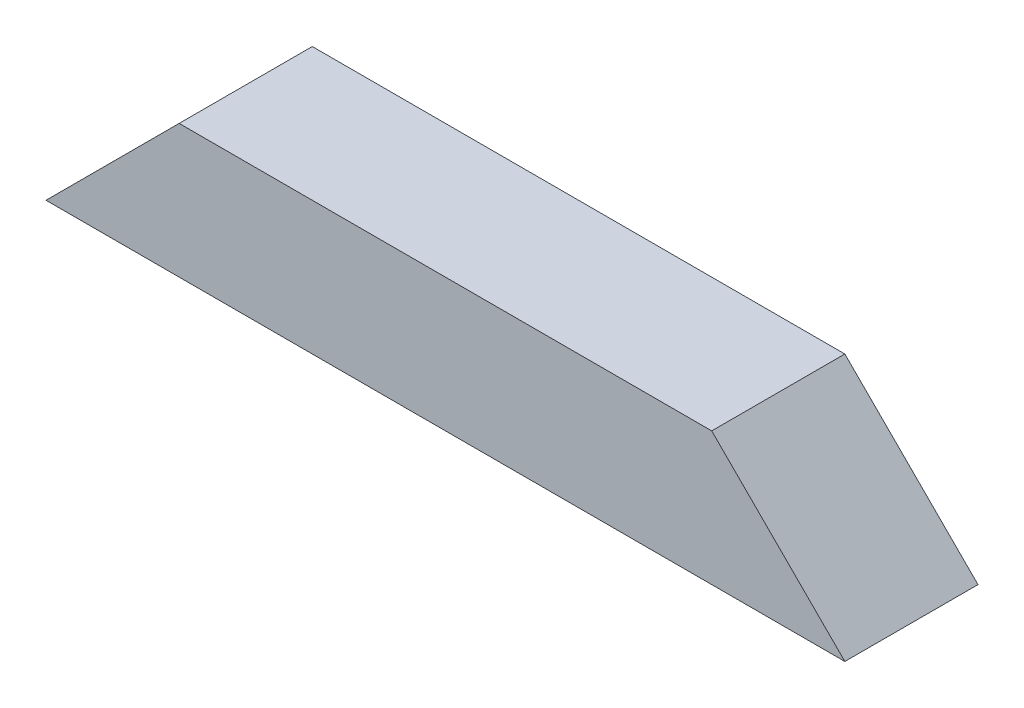
ISO-10303-21;
HEADER;
FILE_DESCRIPTION(('STEP AP214'),'2;1');
FILE_NAME('part.step','',(''),(''),'','','');
FILE_SCHEMA(('AUTOMOTIVE_DESIGN { 1 0 10303 214 1 1 1 1 }'));
ENDSEC;
DATA;
#1=APPLICATION_CONTEXT('core data for automotive mechanical design processes');
#2=APPLICATION_PROTOCOL_DEFINITION('international standard','automotive_design',2000,#1);
#3=PRODUCT_CONTEXT('',#1,'mechanical');
#4=PRODUCT('Part','Part','',(#3));
#5=PRODUCT_RELATED_PRODUCT_CATEGORY('part','',(#4));
#6=PRODUCT_DEFINITION_FORMATION('','',#4);
#7=PRODUCT_DEFINITION_CONTEXT('part definition',#1,'design');
#8=PRODUCT_DEFINITION('design','',#6,#7);
#9=PRODUCT_DEFINITION_SHAPE('','',#8);
#10=(LENGTH_UNIT() NAMED_UNIT(*) SI_UNIT(.MILLI.,.METRE.));
#11=(NAMED_UNIT(*) PLANE_ANGLE_UNIT() SI_UNIT($,.RADIAN.));
#12=(NAMED_UNIT(*) SI_UNIT($,.STERADIAN.) SOLID_ANGLE_UNIT());
#13=UNCERTAINTY_MEASURE_WITH_UNIT(LENGTH_MEASURE(1.E-05),#10,'distance_accuracy_value','');
#14=(GEOMETRIC_REPRESENTATION_CONTEXT(3) GLOBAL_UNCERTAINTY_ASSIGNED_CONTEXT((#13)) GLOBAL_UNIT_ASSIGNED_CONTEXT((#10,
#11,#12)) REPRESENTATION_CONTEXT('',''));
#15=CARTESIAN_POINT('',(0.,0.,0.));
#16=DIRECTION('',(0.,0.,1.));
#17=DIRECTION('',(1.,0.,0.));
#18=AXIS2_PLACEMENT_3D('',#15,#16,#17);
#19=CARTESIAN_POINT('',(152.4,25.4,50.8));
#20=DIRECTION('',(0.,-1.,0.));
#21=DIRECTION('',(1.,0.,0.));
#22=AXIS2_PLACEMENT_3D('',#19,#20,#21);
#23=PLANE('',#22);
#24=DIRECTION('',(0.,0.,1.));
#25=VECTOR('',#24,1.);
#26=CARTESIAN_POINT('',(101.6,25.4,0.));
#27=LINE('',#26,#25);
#28=CARTESIAN_POINT('',(101.6,25.4,0.));
#29=VERTEX_POINT('',#28);
#30=CARTESIAN_POINT('',(101.6,25.4,50.8));
#31=VERTEX_POINT('',#30);
#32=EDGE_CURVE('E86',#29,#31,#27,.T.);
#33=ORIENTED_EDGE('',*,*,#32,.F.);
#34=DIRECTION('',(-1.,0.,0.));
#35=VECTOR('',#34,1.);
#36=CARTESIAN_POINT('',(152.4,25.4,0.));
#37=LINE('',#36,#35);
#38=CARTESIAN_POINT('',(-101.6,25.4,0.));
#39=VERTEX_POINT('',#38);
#40=EDGE_CURVE('E85',#29,#39,#37,.T.);
#41=ORIENTED_EDGE('',*,*,#40,.T.);
#42=DIRECTION('',(0.,0.,1.));
#43=VECTOR('',#42,1.);
#44=CARTESIAN_POINT('',(-101.6,25.4,0.));
#45=LINE('',#44,#43);
#46=CARTESIAN_POINT('',(-101.6,25.4,50.8));
#47=VERTEX_POINT('',#46);
#48=EDGE_CURVE('E88',#39,#47,#45,.T.);
#49=ORIENTED_EDGE('',*,*,#48,.T.);
#50=DIRECTION('',(-1.,0.,0.));
#51=VECTOR('',#50,1.);
#52=CARTESIAN_POINT('',(152.4,25.4,50.8));
#53=LINE('',#52,#51);
#54=EDGE_CURVE('E80',#31,#47,#53,.T.);
#55=ORIENTED_EDGE('',*,*,#54,.F.);
#56=EDGE_LOOP('',(#33,#41,#49,#55));
#57=FACE_BOUND('',#56,.T.);
#58=ADVANCED_FACE('F33',(#57),#23,.F.);
#59=CARTESIAN_POINT('',(0.,0.,50.8));
#60=DIRECTION('',(0.,0.,1.));
#61=DIRECTION('',(1.,0.,0.));
#62=AXIS2_PLACEMENT_3D('',#59,#60,#61);
#63=PLANE('',#62);
#64=DIRECTION('',(1.,0.,0.));
#65=VECTOR('',#64,1.);
#66=CARTESIAN_POINT('',(152.4,-25.4,50.8));
#67=LINE('',#66,#65);
#68=CARTESIAN_POINT('',(-152.4,-25.4,50.8));
#69=VERTEX_POINT('',#68);
#70=CARTESIAN_POINT('',(152.4,-25.4,50.8));
#71=VERTEX_POINT('',#70);
#72=EDGE_CURVE('E90',#69,#71,#67,.T.);
#73=ORIENTED_EDGE('',*,*,#72,.T.);
#74=DIRECTION('',(-0.707106781186548,0.707106781186548,0.));
#75=VECTOR('',#74,1.);
#76=CARTESIAN_POINT('',(63.4999999999999,63.4999999999999,50.8));
#77=LINE('',#76,#75);
#78=EDGE_CURVE('E56',#71,#31,#77,.T.);
#79=ORIENTED_EDGE('',*,*,#78,.T.);
#80=ORIENTED_EDGE('',*,*,#54,.T.);
#81=DIRECTION('',(0.707106781186548,0.707106781186548,0.));
#82=VECTOR('',#81,1.);
#83=CARTESIAN_POINT('',(-63.4999999999999,63.4999999999999,50.8));
#84=LINE('',#83,#82);
#85=EDGE_CURVE('E97',#69,#47,#84,.T.);
#86=ORIENTED_EDGE('',*,*,#85,.F.);
#87=EDGE_LOOP('',(#73,#79,#80,#86));
#88=FACE_BOUND('',#87,.T.);
#89=ADVANCED_FACE('F104',(#88),#63,.T.);
#90=CARTESIAN_POINT('',(0.,0.,0.));
#91=DIRECTION('',(0.,0.,1.));
#92=DIRECTION('',(1.,0.,0.));
#93=AXIS2_PLACEMENT_3D('',#90,#91,#92);
#94=PLANE('',#93);
#95=DIRECTION('',(-0.707106781186548,0.707106781186548,0.));
#96=VECTOR('',#95,1.);
#97=CARTESIAN_POINT('',(63.4999999999999,63.4999999999999,0.));
#98=LINE('',#97,#96);
#99=CARTESIAN_POINT('',(152.4,-25.4,0.));
#100=VERTEX_POINT('',#99);
#101=EDGE_CURVE('E75',#100,#29,#98,.T.);
#102=ORIENTED_EDGE('',*,*,#101,.F.);
#103=DIRECTION('',(1.,0.,0.));
#104=VECTOR('',#103,1.);
#105=CARTESIAN_POINT('',(152.4,-25.4,0.));
#106=LINE('',#105,#104);
#107=CARTESIAN_POINT('',(-152.4,-25.4,0.));
#108=VERTEX_POINT('',#107);
#109=EDGE_CURVE('E84',#108,#100,#106,.T.);
#110=ORIENTED_EDGE('',*,*,#109,.F.);
#111=DIRECTION('',(0.707106781186548,0.707106781186548,0.));
#112=VECTOR('',#111,1.);
#113=CARTESIAN_POINT('',(-63.4999999999999,63.4999999999999,0.));
#114=LINE('',#113,#112);
#115=EDGE_CURVE('E48',#108,#39,#114,.T.);
#116=ORIENTED_EDGE('',*,*,#115,.T.);
#117=ORIENTED_EDGE('',*,*,#40,.F.);
#118=EDGE_LOOP('',(#102,#110,#116,#117));
#119=FACE_BOUND('',#118,.T.);
#120=ADVANCED_FACE('F83',(#119),#94,.F.);
#121=CARTESIAN_POINT('',(152.4,-25.4,50.8));
#122=DIRECTION('',(0.,1.,0.));
#123=DIRECTION('',(-1.,0.,0.));
#124=AXIS2_PLACEMENT_3D('',#121,#122,#123);
#125=PLANE('',#124);
#126=ORIENTED_EDGE('',*,*,#109,.T.);
#127=DIRECTION('',(0.,0.,-1.));
#128=VECTOR('',#127,1.);
#129=CARTESIAN_POINT('',(152.4,-25.4,50.8));
#130=LINE('',#129,#128);
#131=EDGE_CURVE('E41',#71,#100,#130,.T.);
#132=ORIENTED_EDGE('',*,*,#131,.F.);
#133=ORIENTED_EDGE('',*,*,#72,.F.);
#134=DIRECTION('',(0.,0.,-1.));
#135=VECTOR('',#134,1.);
#136=CARTESIAN_POINT('',(-152.4,-25.4,50.8));
#137=LINE('',#136,#135);
#138=EDGE_CURVE('E11',#69,#108,#137,.T.);
#139=ORIENTED_EDGE('',*,*,#138,.T.);
#140=EDGE_LOOP('',(#126,#132,#133,#139));
#141=FACE_BOUND('',#140,.T.);
#142=ADVANCED_FACE('F35',(#141),#125,.F.);
#143=CARTESIAN_POINT('',(-63.4999999999999,63.4999999999999,0.));
#144=DIRECTION('',(0.707106781186548,-0.707106781186548,0.));
#145=DIRECTION('',(0.707106781186548,0.707106781186548,0.));
#146=AXIS2_PLACEMENT_3D('',#143,#144,#145);
#147=PLANE('',#146);
#148=ORIENTED_EDGE('',*,*,#85,.T.);
#149=ORIENTED_EDGE('',*,*,#48,.F.);
#150=ORIENTED_EDGE('',*,*,#115,.F.);
#151=ORIENTED_EDGE('',*,*,#138,.F.);
#152=EDGE_LOOP('',(#148,#149,#150,#151));
#153=FACE_BOUND('',#152,.T.);
#154=ADVANCED_FACE('F107',(#153),#147,.F.);
#155=CARTESIAN_POINT('',(63.4999999999999,63.4999999999999,0.));
#156=DIRECTION('',(0.707106781186548,0.707106781186548,0.));
#157=DIRECTION('',(-0.707106781186548,0.707106781186548,0.));
#158=AXIS2_PLACEMENT_3D('',#155,#156,#157);
#159=PLANE('',#158);
#160=ORIENTED_EDGE('',*,*,#78,.F.);
#161=ORIENTED_EDGE('',*,*,#131,.T.);
#162=ORIENTED_EDGE('',*,*,#101,.T.);
#163=ORIENTED_EDGE('',*,*,#32,.T.);
#164=EDGE_LOOP('',(#160,#161,#162,#163));
#165=FACE_BOUND('',#164,.T.);
#166=ADVANCED_FACE('F74',(#165),#159,.T.);
#167=CLOSED_SHELL('',(#58,#89,#120,#142,#154,#166));
#168=MANIFOLD_SOLID_BREP('B2',#167);
#169=ADVANCED_BREP_SHAPE_REPRESENTATION('',(#18,#168),#14);
#170=SHAPE_DEFINITION_REPRESENTATION(#9,#169);
ENDSEC;
END-ISO-10303-21;
